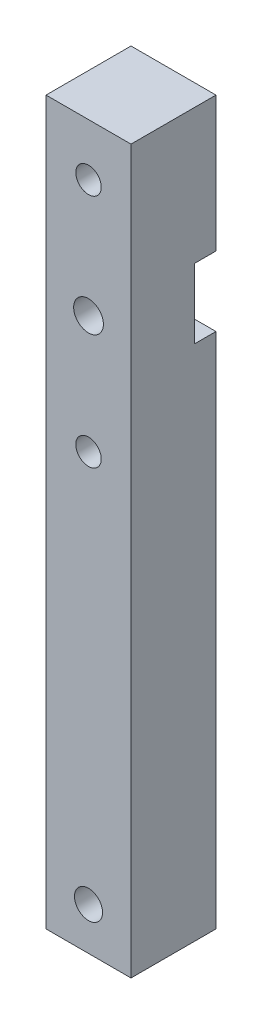
ISO-10303-21;
HEADER;
FILE_DESCRIPTION(('STEP AP214'),'2;1');
FILE_NAME('part.step','',(''),(''),'','','');
FILE_SCHEMA(('AUTOMOTIVE_DESIGN { 1 0 10303 214 1 1 1 1 }'));
ENDSEC;
DATA;
#1=APPLICATION_CONTEXT('core data for automotive mechanical design processes');
#2=APPLICATION_PROTOCOL_DEFINITION('international standard','automotive_design',2000,#1);
#3=PRODUCT_CONTEXT('',#1,'mechanical');
#4=PRODUCT('Part','Part','',(#3));
#5=PRODUCT_RELATED_PRODUCT_CATEGORY('part','',(#4));
#6=PRODUCT_DEFINITION_FORMATION('','',#4);
#7=PRODUCT_DEFINITION_CONTEXT('part definition',#1,'design');
#8=PRODUCT_DEFINITION('design','',#6,#7);
#9=PRODUCT_DEFINITION_SHAPE('','',#8);
#10=(LENGTH_UNIT() NAMED_UNIT(*) SI_UNIT(.MILLI.,.METRE.));
#11=(NAMED_UNIT(*) PLANE_ANGLE_UNIT() SI_UNIT($,.RADIAN.));
#12=(NAMED_UNIT(*) SI_UNIT($,.STERADIAN.) SOLID_ANGLE_UNIT());
#13=UNCERTAINTY_MEASURE_WITH_UNIT(LENGTH_MEASURE(1.E-05),#10,'distance_accuracy_value','');
#14=(GEOMETRIC_REPRESENTATION_CONTEXT(3) GLOBAL_UNCERTAINTY_ASSIGNED_CONTEXT((#13)) GLOBAL_UNIT_ASSIGNED_CONTEXT((#10,
#11,#12)) REPRESENTATION_CONTEXT('',''));
#15=CARTESIAN_POINT('',(0.,0.,0.));
#16=DIRECTION('',(0.,0.,1.));
#17=DIRECTION('',(1.,0.,0.));
#18=AXIS2_PLACEMENT_3D('',#15,#16,#17);
#19=CARTESIAN_POINT('',(0.,85.,0.));
#20=DIRECTION('',(1.,0.,0.));
#21=DIRECTION('',(0.,0.,-1.));
#22=AXIS2_PLACEMENT_3D('',#19,#20,#21);
#23=PLANE('',#22);
#24=DIRECTION('',(0.,0.,-1.));
#25=VECTOR('',#24,1.);
#26=CARTESIAN_POINT('',(0.,60.9,-7.5));
#27=LINE('',#26,#25);
#28=CARTESIAN_POINT('',(0.,60.9,-7.5));
#29=VERTEX_POINT('',#28);
#30=CARTESIAN_POINT('',(0.,60.9,-10.));
#31=VERTEX_POINT('',#30);
#32=EDGE_CURVE('E105',#29,#31,#27,.T.);
#33=ORIENTED_EDGE('',*,*,#32,.T.);
#34=DIRECTION('',(0.,-1.,0.));
#35=VECTOR('',#34,1.);
#36=CARTESIAN_POINT('',(0.,85.,-10.));
#37=LINE('',#36,#35);
#38=CARTESIAN_POINT('',(0.,0.,-10.));
#39=VERTEX_POINT('',#38);
#40=EDGE_CURVE('E78',#31,#39,#37,.T.);
#41=ORIENTED_EDGE('',*,*,#40,.T.);
#42=DIRECTION('',(0.,0.,1.));
#43=VECTOR('',#42,1.);
#44=CARTESIAN_POINT('',(0.,0.,0.));
#45=LINE('',#44,#43);
#46=CARTESIAN_POINT('',(0.,0.,0.));
#47=VERTEX_POINT('',#46);
#48=EDGE_CURVE('E136',#39,#47,#45,.T.);
#49=ORIENTED_EDGE('',*,*,#48,.T.);
#50=DIRECTION('',(0.,-1.,0.));
#51=VECTOR('',#50,1.);
#52=CARTESIAN_POINT('',(0.,85.,0.));
#53=LINE('',#52,#51);
#54=CARTESIAN_POINT('',(0.,85.,0.));
#55=VERTEX_POINT('',#54);
#56=EDGE_CURVE('E11',#55,#47,#53,.T.);
#57=ORIENTED_EDGE('',*,*,#56,.F.);
#58=DIRECTION('',(0.,0.,1.));
#59=VECTOR('',#58,1.);
#60=CARTESIAN_POINT('',(0.,85.,0.));
#61=LINE('',#60,#59);
#62=CARTESIAN_POINT('',(0.,85.,-10.));
#63=VERTEX_POINT('',#62);
#64=EDGE_CURVE('E141',#63,#55,#61,.T.);
#65=ORIENTED_EDGE('',*,*,#64,.F.);
#66=CARTESIAN_POINT('',(0.,69.1,-10.));
#67=VERTEX_POINT('',#66);
#68=EDGE_CURVE('E155',#63,#67,#37,.T.);
#69=ORIENTED_EDGE('',*,*,#68,.T.);
#70=DIRECTION('',(0.,0.,-1.));
#71=VECTOR('',#70,1.);
#72=CARTESIAN_POINT('',(0.,69.1,-7.5));
#73=LINE('',#72,#71);
#74=CARTESIAN_POINT('',(0.,69.1,-7.5));
#75=VERTEX_POINT('',#74);
#76=EDGE_CURVE('E47',#75,#67,#73,.T.);
#77=ORIENTED_EDGE('',*,*,#76,.F.);
#78=DIRECTION('',(0.,1.,0.));
#79=VECTOR('',#78,1.);
#80=CARTESIAN_POINT('',(0.,0.,-7.5));
#81=LINE('',#80,#79);
#82=EDGE_CURVE('E119',#29,#75,#81,.T.);
#83=ORIENTED_EDGE('',*,*,#82,.F.);
#84=EDGE_LOOP('',(#33,#41,#49,#57,#65,#69,#77,#83));
#85=FACE_BOUND('',#84,.T.);
#86=ADVANCED_FACE('F33',(#85),#23,.F.);
#87=CARTESIAN_POINT('',(10.,85.,0.));
#88=DIRECTION('',(-1.,0.,0.));
#89=DIRECTION('',(0.,0.,1.));
#90=AXIS2_PLACEMENT_3D('',#87,#88,#89);
#91=PLANE('',#90);
#92=DIRECTION('',(0.,0.,-1.));
#93=VECTOR('',#92,1.);
#94=CARTESIAN_POINT('',(10.,60.9,-7.5));
#95=LINE('',#94,#93);
#96=CARTESIAN_POINT('',(10.,60.9,-7.5));
#97=VERTEX_POINT('',#96);
#98=CARTESIAN_POINT('',(10.,60.9,-10.));
#99=VERTEX_POINT('',#98);
#100=EDGE_CURVE('E134',#97,#99,#95,.T.);
#101=ORIENTED_EDGE('',*,*,#100,.F.);
#102=DIRECTION('',(0.,-1.,0.));
#103=VECTOR('',#102,1.);
#104=CARTESIAN_POINT('',(10.,0.,-7.5));
#105=LINE('',#104,#103);
#106=CARTESIAN_POINT('',(10.,69.1,-7.5));
#107=VERTEX_POINT('',#106);
#108=EDGE_CURVE('E113',#107,#97,#105,.T.);
#109=ORIENTED_EDGE('',*,*,#108,.F.);
#110=DIRECTION('',(0.,0.,-1.));
#111=VECTOR('',#110,1.);
#112=CARTESIAN_POINT('',(10.,69.1,-7.5));
#113=LINE('',#112,#111);
#114=CARTESIAN_POINT('',(10.,69.1,-10.));
#115=VERTEX_POINT('',#114);
#116=EDGE_CURVE('E137',#107,#115,#113,.T.);
#117=ORIENTED_EDGE('',*,*,#116,.T.);
#118=DIRECTION('',(0.,-1.,0.));
#119=VECTOR('',#118,1.);
#120=CARTESIAN_POINT('',(10.,85.,-10.));
#121=LINE('',#120,#119);
#122=CARTESIAN_POINT('',(10.,85.,-10.));
#123=VERTEX_POINT('',#122);
#124=EDGE_CURVE('E158',#123,#115,#121,.T.);
#125=ORIENTED_EDGE('',*,*,#124,.F.);
#126=DIRECTION('',(0.,0.,-1.));
#127=VECTOR('',#126,1.);
#128=CARTESIAN_POINT('',(10.,85.,0.));
#129=LINE('',#128,#127);
#130=CARTESIAN_POINT('',(10.,85.,0.));
#131=VERTEX_POINT('',#130);
#132=EDGE_CURVE('E145',#131,#123,#129,.T.);
#133=ORIENTED_EDGE('',*,*,#132,.F.);
#134=DIRECTION('',(0.,-1.,0.));
#135=VECTOR('',#134,1.);
#136=CARTESIAN_POINT('',(10.,85.,0.));
#137=LINE('',#136,#135);
#138=CARTESIAN_POINT('',(10.,0.,0.));
#139=VERTEX_POINT('',#138);
#140=EDGE_CURVE('E40',#131,#139,#137,.T.);
#141=ORIENTED_EDGE('',*,*,#140,.T.);
#142=DIRECTION('',(0.,0.,-1.));
#143=VECTOR('',#142,1.);
#144=CARTESIAN_POINT('',(10.,0.,0.));
#145=LINE('',#144,#143);
#146=CARTESIAN_POINT('',(10.,0.,-10.));
#147=VERTEX_POINT('',#146);
#148=EDGE_CURVE('E151',#139,#147,#145,.T.);
#149=ORIENTED_EDGE('',*,*,#148,.T.);
#150=EDGE_CURVE('E157',#99,#147,#121,.T.);
#151=ORIENTED_EDGE('',*,*,#150,.F.);
#152=EDGE_LOOP('',(#101,#109,#117,#125,#133,#141,#149,#151));
#153=FACE_BOUND('',#152,.T.);
#154=ADVANCED_FACE('F164',(#153),#91,.F.);
#155=CARTESIAN_POINT('',(0.,85.,-10.));
#156=DIRECTION('',(0.,0.,1.));
#157=DIRECTION('',(1.,0.,0.));
#158=AXIS2_PLACEMENT_3D('',#155,#156,#157);
#159=PLANE('',#158);
#160=CARTESIAN_POINT('',(5.,5.,-10.));
#161=DIRECTION('',(0.,0.,1.));
#162=DIRECTION('',(1.,0.,0.));
#163=AXIS2_PLACEMENT_3D('',#160,#161,#162);
#164=CIRCLE('',#163,1.65);
#165=CARTESIAN_POINT('',(6.65,5.,-10.));
#166=VERTEX_POINT('',#165);
#167=EDGE_CURVE('E226',#166,#166,#164,.T.);
#168=ORIENTED_EDGE('',*,*,#167,.T.);
#169=EDGE_LOOP('',(#168));
#170=FACE_BOUND('',#169,.T.);
#171=CARTESIAN_POINT('',(5.,51.144,-10.));
#172=DIRECTION('',(0.,0.,-1.));
#173=DIRECTION('',(-1.,0.,0.));
#174=AXIS2_PLACEMENT_3D('',#171,#172,#173);
#175=CIRCLE('',#174,1.5);
#176=CARTESIAN_POINT('',(3.5,51.144,-10.));
#177=VERTEX_POINT('',#176);
#178=EDGE_CURVE('E223',#177,#177,#175,.T.);
#179=ORIENTED_EDGE('',*,*,#178,.F.);
#180=EDGE_LOOP('',(#179));
#181=FACE_BOUND('',#180,.T.);
#182=DIRECTION('',(1.,0.,0.));
#183=VECTOR('',#182,1.);
#184=CARTESIAN_POINT('',(0.,60.9,-10.));
#185=LINE('',#184,#183);
#186=EDGE_CURVE('E111',#31,#99,#185,.T.);
#187=ORIENTED_EDGE('',*,*,#186,.T.);
#188=ORIENTED_EDGE('',*,*,#150,.T.);
#189=DIRECTION('',(-1.,0.,0.));
#190=VECTOR('',#189,1.);
#191=CARTESIAN_POINT('',(0.,0.,-10.));
#192=LINE('',#191,#190);
#193=EDGE_CURVE('E143',#147,#39,#192,.T.);
#194=ORIENTED_EDGE('',*,*,#193,.T.);
#195=ORIENTED_EDGE('',*,*,#40,.F.);
#196=EDGE_LOOP('',(#187,#188,#194,#195));
#197=FACE_BOUND('',#196,.T.);
#198=ADVANCED_FACE('F172',(#170,#181,#197),#159,.F.);
#199=CARTESIAN_POINT('',(0.,85.,0.));
#200=DIRECTION('',(0.,0.,-1.));
#201=DIRECTION('',(-1.,0.,0.));
#202=AXIS2_PLACEMENT_3D('',#199,#200,#201);
#203=PLANE('',#202);
#204=CARTESIAN_POINT('',(5.,5.,0.));
#205=DIRECTION('',(0.,0.,1.));
#206=DIRECTION('',(1.,0.,0.));
#207=AXIS2_PLACEMENT_3D('',#204,#205,#206);
#208=CIRCLE('',#207,1.65);
#209=CARTESIAN_POINT('',(6.65,5.,0.));
#210=VERTEX_POINT('',#209);
#211=EDGE_CURVE('E205',#210,#210,#208,.T.);
#212=ORIENTED_EDGE('',*,*,#211,.F.);
#213=EDGE_LOOP('',(#212));
#214=FACE_BOUND('',#213,.T.);
#215=CARTESIAN_POINT('',(5.,78.856,0.));
#216=DIRECTION('',(0.,0.,-1.));
#217=DIRECTION('',(-1.,0.,0.));
#218=AXIS2_PLACEMENT_3D('',#215,#216,#217);
#219=CIRCLE('',#218,1.5);
#220=CARTESIAN_POINT('',(3.5,78.856,0.));
#221=VERTEX_POINT('',#220);
#222=EDGE_CURVE('E209',#221,#221,#219,.T.);
#223=ORIENTED_EDGE('',*,*,#222,.T.);
#224=EDGE_LOOP('',(#223));
#225=FACE_BOUND('',#224,.T.);
#226=CARTESIAN_POINT('',(5.,51.144,0.));
#227=DIRECTION('',(0.,0.,-1.));
#228=DIRECTION('',(-1.,0.,0.));
#229=AXIS2_PLACEMENT_3D('',#226,#227,#228);
#230=CIRCLE('',#229,1.5);
#231=CARTESIAN_POINT('',(3.5,51.144,0.));
#232=VERTEX_POINT('',#231);
#233=EDGE_CURVE('E213',#232,#232,#230,.T.);
#234=ORIENTED_EDGE('',*,*,#233,.T.);
#235=EDGE_LOOP('',(#234));
#236=FACE_BOUND('',#235,.T.);
#237=CARTESIAN_POINT('',(5.,65.,0.));
#238=DIRECTION('',(0.,0.,-1.));
#239=DIRECTION('',(-1.,0.,0.));
#240=AXIS2_PLACEMENT_3D('',#237,#238,#239);
#241=CIRCLE('',#240,1.75);
#242=CARTESIAN_POINT('',(3.25,65.,0.));
#243=VERTEX_POINT('',#242);
#244=EDGE_CURVE('E132',#243,#243,#241,.T.);
#245=ORIENTED_EDGE('',*,*,#244,.T.);
#246=EDGE_LOOP('',(#245));
#247=FACE_BOUND('',#246,.T.);
#248=DIRECTION('',(1.,0.,0.));
#249=VECTOR('',#248,1.);
#250=CARTESIAN_POINT('',(0.,0.,0.));
#251=LINE('',#250,#249);
#252=EDGE_CURVE('E149',#47,#139,#251,.T.);
#253=ORIENTED_EDGE('',*,*,#252,.T.);
#254=ORIENTED_EDGE('',*,*,#140,.F.);
#255=DIRECTION('',(1.,0.,0.));
#256=VECTOR('',#255,1.);
#257=CARTESIAN_POINT('',(0.,85.,0.));
#258=LINE('',#257,#256);
#259=EDGE_CURVE('E85',#55,#131,#258,.T.);
#260=ORIENTED_EDGE('',*,*,#259,.F.);
#261=ORIENTED_EDGE('',*,*,#56,.T.);
#262=EDGE_LOOP('',(#253,#254,#260,#261));
#263=FACE_BOUND('',#262,.T.);
#264=ADVANCED_FACE('F185',(#214,#225,#236,#247,#263),#203,.F.);
#265=CARTESIAN_POINT('',(5.,78.856,-10.));
#266=DIRECTION('',(0.,0.,-1.));
#267=DIRECTION('',(-1.,0.,0.));
#268=AXIS2_PLACEMENT_3D('',#265,#266,#267);
#269=CIRCLE('',#268,1.5);
#270=CARTESIAN_POINT('',(3.5,78.856,-10.));
#271=VERTEX_POINT('',#270);
#272=EDGE_CURVE('E220',#271,#271,#269,.T.);
#273=ORIENTED_EDGE('',*,*,#272,.F.);
#274=EDGE_LOOP('',(#273));
#275=FACE_BOUND('',#274,.T.);
#276=ORIENTED_EDGE('',*,*,#124,.T.);
#277=DIRECTION('',(1.,0.,0.));
#278=VECTOR('',#277,1.);
#279=CARTESIAN_POINT('',(0.,69.1,-10.));
#280=LINE('',#279,#278);
#281=EDGE_CURVE('E122',#67,#115,#280,.T.);
#282=ORIENTED_EDGE('',*,*,#281,.F.);
#283=ORIENTED_EDGE('',*,*,#68,.F.);
#284=DIRECTION('',(-1.,0.,0.));
#285=VECTOR('',#284,1.);
#286=CARTESIAN_POINT('',(0.,85.,-10.));
#287=LINE('',#286,#285);
#288=EDGE_CURVE('E56',#123,#63,#287,.T.);
#289=ORIENTED_EDGE('',*,*,#288,.F.);
#290=EDGE_LOOP('',(#276,#282,#283,#289));
#291=FACE_BOUND('',#290,.T.);
#292=ADVANCED_FACE('F174',(#275,#291),#159,.F.);
#293=CARTESIAN_POINT('',(0.,85.,0.));
#294=DIRECTION('',(0.,-1.,0.));
#295=DIRECTION('',(0.,0.,-1.));
#296=AXIS2_PLACEMENT_3D('',#293,#294,#295);
#297=PLANE('',#296);
#298=ORIENTED_EDGE('',*,*,#64,.T.);
#299=ORIENTED_EDGE('',*,*,#259,.T.);
#300=ORIENTED_EDGE('',*,*,#132,.T.);
#301=ORIENTED_EDGE('',*,*,#288,.T.);
#302=EDGE_LOOP('',(#298,#299,#300,#301));
#303=FACE_BOUND('',#302,.T.);
#304=ADVANCED_FACE('F177',(#303),#297,.F.);
#305=CARTESIAN_POINT('',(0.,0.,0.));
#306=DIRECTION('',(0.,-1.,0.));
#307=DIRECTION('',(0.,0.,-1.));
#308=AXIS2_PLACEMENT_3D('',#305,#306,#307);
#309=PLANE('',#308);
#310=ORIENTED_EDGE('',*,*,#48,.F.);
#311=ORIENTED_EDGE('',*,*,#193,.F.);
#312=ORIENTED_EDGE('',*,*,#148,.F.);
#313=ORIENTED_EDGE('',*,*,#252,.F.);
#314=EDGE_LOOP('',(#310,#311,#312,#313));
#315=FACE_BOUND('',#314,.T.);
#316=ADVANCED_FACE('F170',(#315),#309,.T.);
#317=CARTESIAN_POINT('',(0.,60.9,-7.5));
#318=DIRECTION('',(0.,1.,0.));
#319=DIRECTION('',(0.,0.,1.));
#320=AXIS2_PLACEMENT_3D('',#317,#318,#319);
#321=PLANE('',#320);
#322=ORIENTED_EDGE('',*,*,#186,.F.);
#323=ORIENTED_EDGE('',*,*,#32,.F.);
#324=DIRECTION('',(1.,0.,0.));
#325=VECTOR('',#324,1.);
#326=CARTESIAN_POINT('',(0.,60.9,-7.5));
#327=LINE('',#326,#325);
#328=EDGE_CURVE('E108',#29,#97,#327,.T.);
#329=ORIENTED_EDGE('',*,*,#328,.T.);
#330=ORIENTED_EDGE('',*,*,#100,.T.);
#331=EDGE_LOOP('',(#322,#323,#329,#330));
#332=FACE_BOUND('',#331,.T.);
#333=ADVANCED_FACE('F107',(#332),#321,.T.);
#334=CARTESIAN_POINT('',(0.,69.1,-7.5));
#335=DIRECTION('',(0.,1.,0.));
#336=DIRECTION('',(0.,0.,1.));
#337=AXIS2_PLACEMENT_3D('',#334,#335,#336);
#338=PLANE('',#337);
#339=ORIENTED_EDGE('',*,*,#281,.T.);
#340=ORIENTED_EDGE('',*,*,#116,.F.);
#341=DIRECTION('',(1.,0.,0.));
#342=VECTOR('',#341,1.);
#343=CARTESIAN_POINT('',(0.,69.1,-7.5));
#344=LINE('',#343,#342);
#345=EDGE_CURVE('E125',#75,#107,#344,.T.);
#346=ORIENTED_EDGE('',*,*,#345,.F.);
#347=ORIENTED_EDGE('',*,*,#76,.T.);
#348=EDGE_LOOP('',(#339,#340,#346,#347));
#349=FACE_BOUND('',#348,.T.);
#350=ADVANCED_FACE('F255',(#349),#338,.F.);
#351=CARTESIAN_POINT('',(0.,0.,-7.5));
#352=DIRECTION('',(0.,0.,-1.));
#353=DIRECTION('',(-1.,0.,0.));
#354=AXIS2_PLACEMENT_3D('',#351,#352,#353);
#355=PLANE('',#354);
#356=CARTESIAN_POINT('',(5.,65.,-7.5));
#357=DIRECTION('',(0.,0.,-1.));
#358=DIRECTION('',(-1.,0.,0.));
#359=AXIS2_PLACEMENT_3D('',#356,#357,#358);
#360=CIRCLE('',#359,1.75);
#361=CARTESIAN_POINT('',(3.25,65.,-7.5));
#362=VERTEX_POINT('',#361);
#363=EDGE_CURVE('E217',#362,#362,#360,.T.);
#364=ORIENTED_EDGE('',*,*,#363,.F.);
#365=EDGE_LOOP('',(#364));
#366=FACE_BOUND('',#365,.T.);
#367=ORIENTED_EDGE('',*,*,#328,.F.);
#368=ORIENTED_EDGE('',*,*,#82,.T.);
#369=ORIENTED_EDGE('',*,*,#345,.T.);
#370=ORIENTED_EDGE('',*,*,#108,.T.);
#371=EDGE_LOOP('',(#367,#368,#369,#370));
#372=FACE_BOUND('',#371,.T.);
#373=ADVANCED_FACE('F117',(#366,#372),#355,.T.);
#374=CARTESIAN_POINT('',(5.,65.,0.));
#375=DIRECTION('',(0.,0.,-1.));
#376=DIRECTION('',(-1.,0.,0.));
#377=AXIS2_PLACEMENT_3D('',#374,#375,#376);
#378=CYLINDRICAL_SURFACE('',#377,1.75);
#379=ORIENTED_EDGE('',*,*,#244,.F.);
#380=EDGE_LOOP('',(#379));
#381=FACE_BOUND('',#380,.T.);
#382=ORIENTED_EDGE('',*,*,#363,.T.);
#383=EDGE_LOOP('',(#382));
#384=FACE_BOUND('',#383,.T.);
#385=ADVANCED_FACE('F248',(#381,#384),#378,.F.);
#386=CARTESIAN_POINT('',(5.,78.856,-10.));
#387=DIRECTION('',(0.,0.,1.));
#388=DIRECTION('',(1.,0.,0.));
#389=AXIS2_PLACEMENT_3D('',#386,#387,#388);
#390=CYLINDRICAL_SURFACE('',#389,1.5);
#391=ORIENTED_EDGE('',*,*,#272,.T.);
#392=EDGE_LOOP('',(#391));
#393=FACE_BOUND('',#392,.T.);
#394=ORIENTED_EDGE('',*,*,#222,.F.);
#395=EDGE_LOOP('',(#394));
#396=FACE_BOUND('',#395,.T.);
#397=ADVANCED_FACE('F243',(#393,#396),#390,.F.);
#398=CARTESIAN_POINT('',(5.,51.144,-10.));
#399=DIRECTION('',(0.,0.,1.));
#400=DIRECTION('',(1.,0.,0.));
#401=AXIS2_PLACEMENT_3D('',#398,#399,#400);
#402=CYLINDRICAL_SURFACE('',#401,1.5);
#403=ORIENTED_EDGE('',*,*,#178,.T.);
#404=EDGE_LOOP('',(#403));
#405=FACE_BOUND('',#404,.T.);
#406=ORIENTED_EDGE('',*,*,#233,.F.);
#407=EDGE_LOOP('',(#406));
#408=FACE_BOUND('',#407,.T.);
#409=ADVANCED_FACE('F238',(#405,#408),#402,.F.);
#410=CARTESIAN_POINT('',(5.,5.,-10.));
#411=DIRECTION('',(0.,0.,1.));
#412=DIRECTION('',(1.,0.,0.));
#413=AXIS2_PLACEMENT_3D('',#410,#411,#412);
#414=CYLINDRICAL_SURFACE('',#413,1.65);
#415=ORIENTED_EDGE('',*,*,#167,.F.);
#416=EDGE_LOOP('',(#415));
#417=FACE_BOUND('',#416,.T.);
#418=ORIENTED_EDGE('',*,*,#211,.T.);
#419=EDGE_LOOP('',(#418));
#420=FACE_BOUND('',#419,.T.);
#421=ADVANCED_FACE('F235',(#417,#420),#414,.F.);
#422=CLOSED_SHELL('',(#86,#154,#198,#264,#292,#304,#316,#333,#350,#373,#385,#397,#409,#421));
#423=MANIFOLD_SOLID_BREP('B2',#422);
#424=ADVANCED_BREP_SHAPE_REPRESENTATION('',(#18,#423),#14);
#425=SHAPE_DEFINITION_REPRESENTATION(#9,#424);
ENDSEC;
END-ISO-10303-21;
